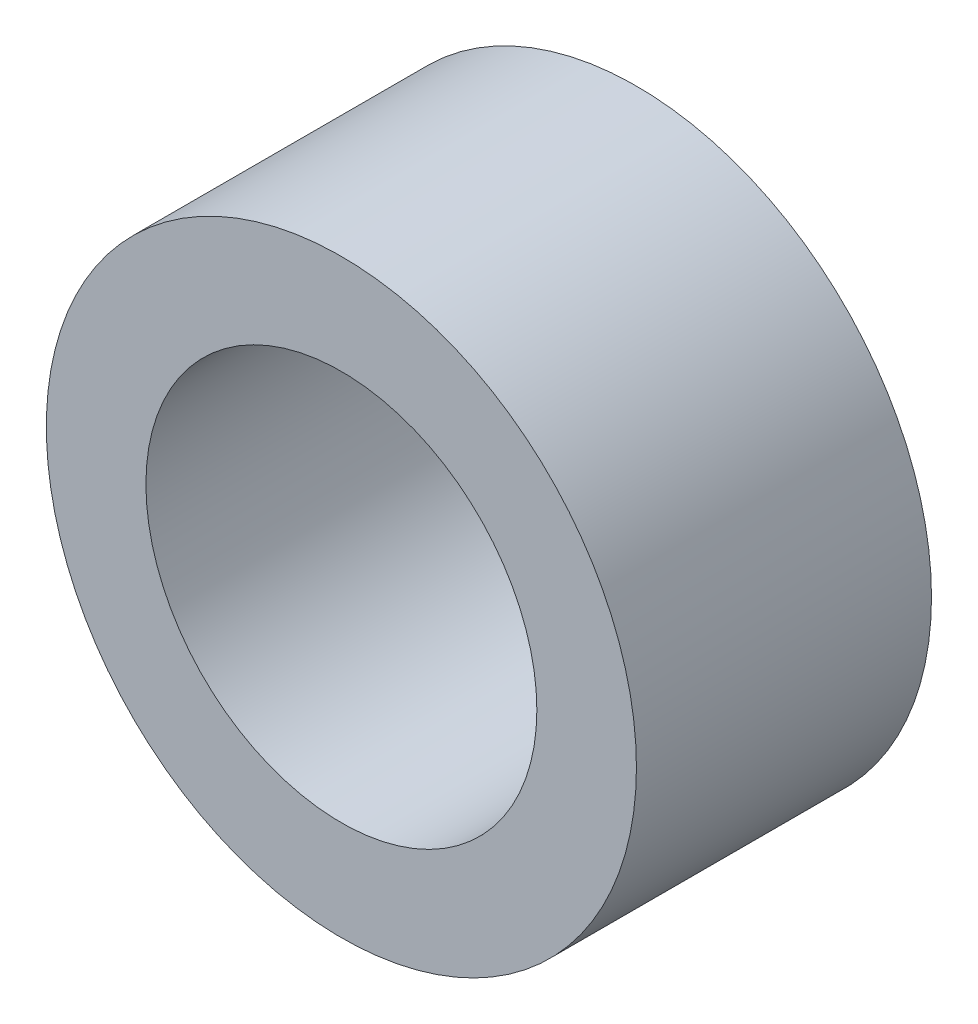
ISO-10303-21;
HEADER;
FILE_DESCRIPTION(('STEP AP214'),'2;1');
FILE_NAME('part.step','',(''),(''),'','','');
FILE_SCHEMA(('AUTOMOTIVE_DESIGN { 1 0 10303 214 1 1 1 1 }'));
ENDSEC;
DATA;
#1=APPLICATION_CONTEXT('core data for automotive mechanical design processes');
#2=APPLICATION_PROTOCOL_DEFINITION('international standard','automotive_design',2000,#1);
#3=PRODUCT_CONTEXT('',#1,'mechanical');
#4=PRODUCT('Part','Part','',(#3));
#5=PRODUCT_RELATED_PRODUCT_CATEGORY('part','',(#4));
#6=PRODUCT_DEFINITION_FORMATION('','',#4);
#7=PRODUCT_DEFINITION_CONTEXT('part definition',#1,'design');
#8=PRODUCT_DEFINITION('design','',#6,#7);
#9=PRODUCT_DEFINITION_SHAPE('','',#8);
#10=(LENGTH_UNIT() NAMED_UNIT(*) SI_UNIT(.MILLI.,.METRE.));
#11=(NAMED_UNIT(*) PLANE_ANGLE_UNIT() SI_UNIT($,.RADIAN.));
#12=(NAMED_UNIT(*) SI_UNIT($,.STERADIAN.) SOLID_ANGLE_UNIT());
#13=UNCERTAINTY_MEASURE_WITH_UNIT(LENGTH_MEASURE(1.E-05),#10,'distance_accuracy_value','');
#14=(GEOMETRIC_REPRESENTATION_CONTEXT(3) GLOBAL_UNCERTAINTY_ASSIGNED_CONTEXT((#13)) GLOBAL_UNIT_ASSIGNED_CONTEXT((#10,
#11,#12)) REPRESENTATION_CONTEXT('',''));
#15=CARTESIAN_POINT('',(0.,0.,0.));
#16=DIRECTION('',(0.,0.,1.));
#17=DIRECTION('',(1.,0.,0.));
#18=AXIS2_PLACEMENT_3D('',#15,#16,#17);
#19=CARTESIAN_POINT('',(0.,0.,2.));
#20=DIRECTION('',(0.,0.,1.));
#21=DIRECTION('',(1.,0.,0.));
#22=AXIS2_PLACEMENT_3D('',#19,#20,#21);
#23=PLANE('',#22);
#24=CARTESIAN_POINT('',(0.,0.,2.));
#25=DIRECTION('',(0.,0.,1.));
#26=DIRECTION('',(1.,0.,0.));
#27=AXIS2_PLACEMENT_3D('',#24,#25,#26);
#28=CIRCLE('',#27,4.);
#29=CARTESIAN_POINT('',(4.,0.,2.));
#30=VERTEX_POINT('',#29);
#31=EDGE_CURVE('E10',#30,#30,#28,.T.);
#32=ORIENTED_EDGE('',*,*,#31,.T.);
#33=EDGE_LOOP('',(#32));
#34=FACE_BOUND('',#33,.T.);
#35=CARTESIAN_POINT('',(0.,0.,2.));
#36=DIRECTION('',(0.,0.,1.));
#37=DIRECTION('',(1.,0.,0.));
#38=AXIS2_PLACEMENT_3D('',#35,#36,#37);
#39=CIRCLE('',#38,2.65);
#40=CARTESIAN_POINT('',(2.65,0.,2.));
#41=VERTEX_POINT('',#40);
#42=EDGE_CURVE('E40',#41,#41,#39,.T.);
#43=ORIENTED_EDGE('',*,*,#42,.F.);
#44=EDGE_LOOP('',(#43));
#45=FACE_BOUND('',#44,.T.);
#46=ADVANCED_FACE('F29',(#34,#45),#23,.T.);
#47=CARTESIAN_POINT('',(0.,0.,-2.));
#48=DIRECTION('',(0.,0.,1.));
#49=DIRECTION('',(1.,0.,0.));
#50=AXIS2_PLACEMENT_3D('',#47,#48,#49);
#51=PLANE('',#50);
#52=CARTESIAN_POINT('',(0.,0.,-2.));
#53=DIRECTION('',(0.,0.,1.));
#54=DIRECTION('',(1.,0.,0.));
#55=AXIS2_PLACEMENT_3D('',#52,#53,#54);
#56=CIRCLE('',#55,4.);
#57=CARTESIAN_POINT('',(4.,0.,-2.));
#58=VERTEX_POINT('',#57);
#59=EDGE_CURVE('E33',#58,#58,#56,.T.);
#60=ORIENTED_EDGE('',*,*,#59,.F.);
#61=EDGE_LOOP('',(#60));
#62=FACE_BOUND('',#61,.T.);
#63=CARTESIAN_POINT('',(0.,0.,-2.));
#64=DIRECTION('',(0.,0.,1.));
#65=DIRECTION('',(1.,0.,0.));
#66=AXIS2_PLACEMENT_3D('',#63,#64,#65);
#67=CIRCLE('',#66,2.65);
#68=CARTESIAN_POINT('',(2.65,0.,-2.));
#69=VERTEX_POINT('',#68);
#70=EDGE_CURVE('E42',#69,#69,#67,.T.);
#71=ORIENTED_EDGE('',*,*,#70,.T.);
#72=EDGE_LOOP('',(#71));
#73=FACE_BOUND('',#72,.T.);
#74=ADVANCED_FACE('F52',(#62,#73),#51,.F.);
#75=CARTESIAN_POINT('',(0.,0.,2.));
#76=DIRECTION('',(0.,0.,-1.));
#77=DIRECTION('',(-1.,0.,0.));
#78=AXIS2_PLACEMENT_3D('',#75,#76,#77);
#79=CYLINDRICAL_SURFACE('',#78,4.);
#80=ORIENTED_EDGE('',*,*,#31,.F.);
#81=EDGE_LOOP('',(#80));
#82=FACE_BOUND('',#81,.T.);
#83=ORIENTED_EDGE('',*,*,#59,.T.);
#84=EDGE_LOOP('',(#83));
#85=FACE_BOUND('',#84,.T.);
#86=ADVANCED_FACE('F31',(#82,#85),#79,.T.);
#87=CARTESIAN_POINT('',(0.,0.,2.));
#88=DIRECTION('',(0.,0.,-1.));
#89=DIRECTION('',(-1.,0.,0.));
#90=AXIS2_PLACEMENT_3D('',#87,#88,#89);
#91=CYLINDRICAL_SURFACE('',#90,2.65);
#92=ORIENTED_EDGE('',*,*,#42,.T.);
#93=EDGE_LOOP('',(#92));
#94=FACE_BOUND('',#93,.T.);
#95=ORIENTED_EDGE('',*,*,#70,.F.);
#96=EDGE_LOOP('',(#95));
#97=FACE_BOUND('',#96,.T.);
#98=ADVANCED_FACE('F48',(#94,#97),#91,.F.);
#99=CLOSED_SHELL('',(#46,#74,#86,#98));
#100=MANIFOLD_SOLID_BREP('B2',#99);
#101=ADVANCED_BREP_SHAPE_REPRESENTATION('',(#18,#100),#14);
#102=SHAPE_DEFINITION_REPRESENTATION(#9,#101);
ENDSEC;
END-ISO-10303-21;
